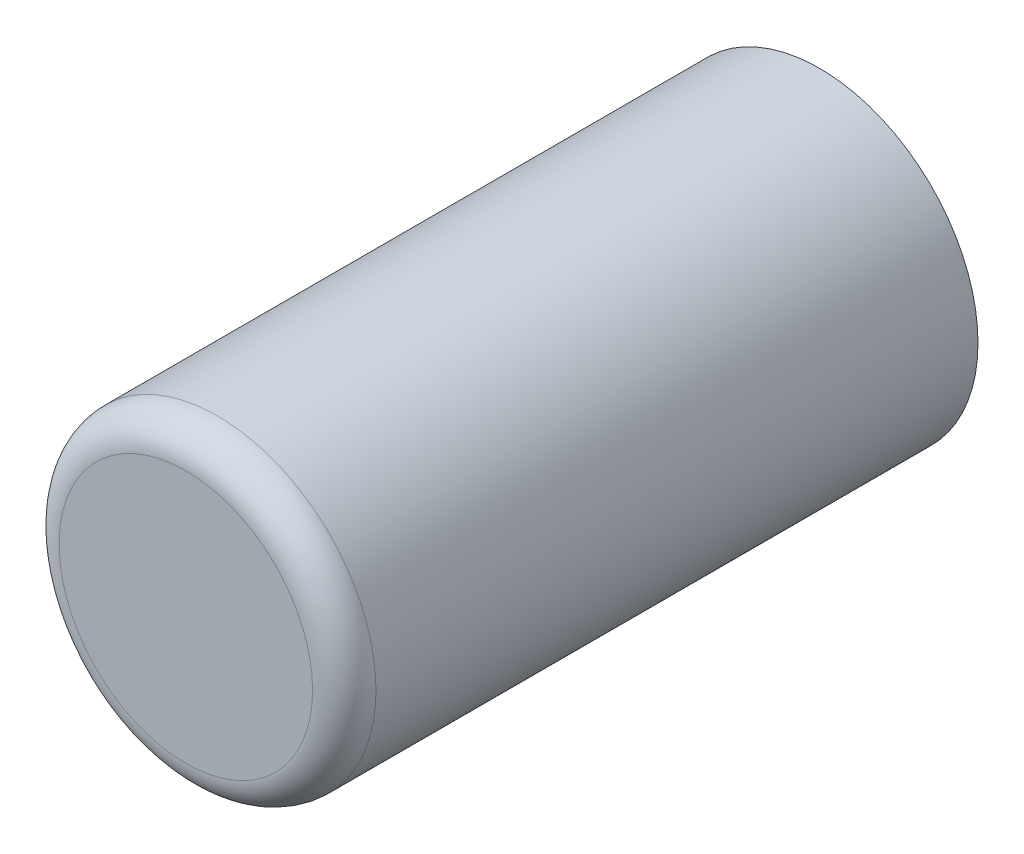
ISO-10303-21;
HEADER;
FILE_DESCRIPTION(('STEP AP214'),'2;1');
FILE_NAME('part.step','',(''),(''),'','','');
FILE_SCHEMA(('AUTOMOTIVE_DESIGN { 1 0 10303 214 1 1 1 1 }'));
ENDSEC;
DATA;
#1=APPLICATION_CONTEXT('core data for automotive mechanical design processes');
#2=APPLICATION_PROTOCOL_DEFINITION('international standard','automotive_design',2000,#1);
#3=PRODUCT_CONTEXT('',#1,'mechanical');
#4=PRODUCT('Part','Part','',(#3));
#5=PRODUCT_RELATED_PRODUCT_CATEGORY('part','',(#4));
#6=PRODUCT_DEFINITION_FORMATION('','',#4);
#7=PRODUCT_DEFINITION_CONTEXT('part definition',#1,'design');
#8=PRODUCT_DEFINITION('design','',#6,#7);
#9=PRODUCT_DEFINITION_SHAPE('','',#8);
#10=(LENGTH_UNIT() NAMED_UNIT(*) SI_UNIT(.MILLI.,.METRE.));
#11=(NAMED_UNIT(*) PLANE_ANGLE_UNIT() SI_UNIT($,.RADIAN.));
#12=(NAMED_UNIT(*) SI_UNIT($,.STERADIAN.) SOLID_ANGLE_UNIT());
#13=UNCERTAINTY_MEASURE_WITH_UNIT(LENGTH_MEASURE(1.E-05),#10,'distance_accuracy_value','');
#14=(GEOMETRIC_REPRESENTATION_CONTEXT(3) GLOBAL_UNCERTAINTY_ASSIGNED_CONTEXT((#13)) GLOBAL_UNIT_ASSIGNED_CONTEXT((#10,
#11,#12)) REPRESENTATION_CONTEXT('',''));
#15=CARTESIAN_POINT('',(0.,0.,0.));
#16=DIRECTION('',(0.,0.,1.));
#17=DIRECTION('',(1.,0.,0.));
#18=AXIS2_PLACEMENT_3D('',#15,#16,#17);
#19=CARTESIAN_POINT('',(0.,0.,100.));
#20=DIRECTION('',(0.,0.,-1.));
#21=DIRECTION('',(-1.,0.,0.));
#22=AXIS2_PLACEMENT_3D('',#19,#20,#21);
#23=CYLINDRICAL_SURFACE('',#22,25.);
#24=CARTESIAN_POINT('',(0.,0.,95.));
#25=DIRECTION('',(0.,0.,1.));
#26=DIRECTION('',(1.,0.,0.));
#27=AXIS2_PLACEMENT_3D('',#24,#25,#26);
#28=CIRCLE('',#27,25.);
#29=CARTESIAN_POINT('',(25.,0.,95.));
#30=VERTEX_POINT('',#29);
#31=EDGE_CURVE('E10',#30,#30,#28,.F.);
#32=ORIENTED_EDGE('',*,*,#31,.T.);
#33=EDGE_LOOP('',(#32));
#34=FACE_BOUND('',#33,.T.);
#35=CARTESIAN_POINT('',(0.,0.,0.));
#36=DIRECTION('',(0.,0.,1.));
#37=DIRECTION('',(1.,0.,0.));
#38=AXIS2_PLACEMENT_3D('',#35,#36,#37);
#39=CIRCLE('',#38,25.);
#40=CARTESIAN_POINT('',(25.,0.,0.));
#41=VERTEX_POINT('',#40);
#42=EDGE_CURVE('E46',#41,#41,#39,.T.);
#43=ORIENTED_EDGE('',*,*,#42,.T.);
#44=EDGE_LOOP('',(#43));
#45=FACE_BOUND('',#44,.T.);
#46=ADVANCED_FACE('F35',(#34,#45),#23,.T.);
#47=CARTESIAN_POINT('',(0.,0.,100.));
#48=DIRECTION('',(0.,0.,1.));
#49=DIRECTION('',(1.,0.,0.));
#50=AXIS2_PLACEMENT_3D('',#47,#48,#49);
#51=PLANE('',#50);
#52=CARTESIAN_POINT('',(0.,0.,100.));
#53=DIRECTION('',(0.,0.,1.));
#54=DIRECTION('',(1.,0.,0.));
#55=AXIS2_PLACEMENT_3D('',#52,#53,#54);
#56=CIRCLE('',#55,20.);
#57=CARTESIAN_POINT('',(20.,0.,100.));
#58=VERTEX_POINT('',#57);
#59=EDGE_CURVE('E42',#58,#58,#56,.T.);
#60=ORIENTED_EDGE('',*,*,#59,.T.);
#61=EDGE_LOOP('',(#60));
#62=FACE_BOUND('',#61,.T.);
#63=ADVANCED_FACE('F56',(#62),#51,.T.);
#64=CARTESIAN_POINT('',(0.,0.,0.));
#65=DIRECTION('',(0.,0.,1.));
#66=DIRECTION('',(1.,0.,0.));
#67=AXIS2_PLACEMENT_3D('',#64,#65,#66);
#68=PLANE('',#67);
#69=ORIENTED_EDGE('',*,*,#42,.F.);
#70=EDGE_LOOP('',(#69));
#71=FACE_BOUND('',#70,.T.);
#72=ADVANCED_FACE('F54',(#71),#68,.F.);
#73=CARTESIAN_POINT('',(0.,0.,95.));
#74=DIRECTION('',(0.,0.,1.));
#75=DIRECTION('',(1.,0.,0.));
#76=AXIS2_PLACEMENT_3D('',#73,#74,#75);
#77=TOROIDAL_SURFACE('',#76,20.,5.);
#78=ORIENTED_EDGE('',*,*,#31,.F.);
#79=EDGE_LOOP('',(#78));
#80=FACE_BOUND('',#79,.T.);
#81=ORIENTED_EDGE('',*,*,#59,.F.);
#82=EDGE_LOOP('',(#81));
#83=FACE_BOUND('',#82,.T.);
#84=ADVANCED_FACE('F37',(#80,#83),#77,.T.);
#85=CLOSED_SHELL('',(#46,#63,#72,#84));
#86=MANIFOLD_SOLID_BREP('B2',#85);
#87=ADVANCED_BREP_SHAPE_REPRESENTATION('',(#18,#86),#14);
#88=SHAPE_DEFINITION_REPRESENTATION(#9,#87);
ENDSEC;
END-ISO-10303-21;
